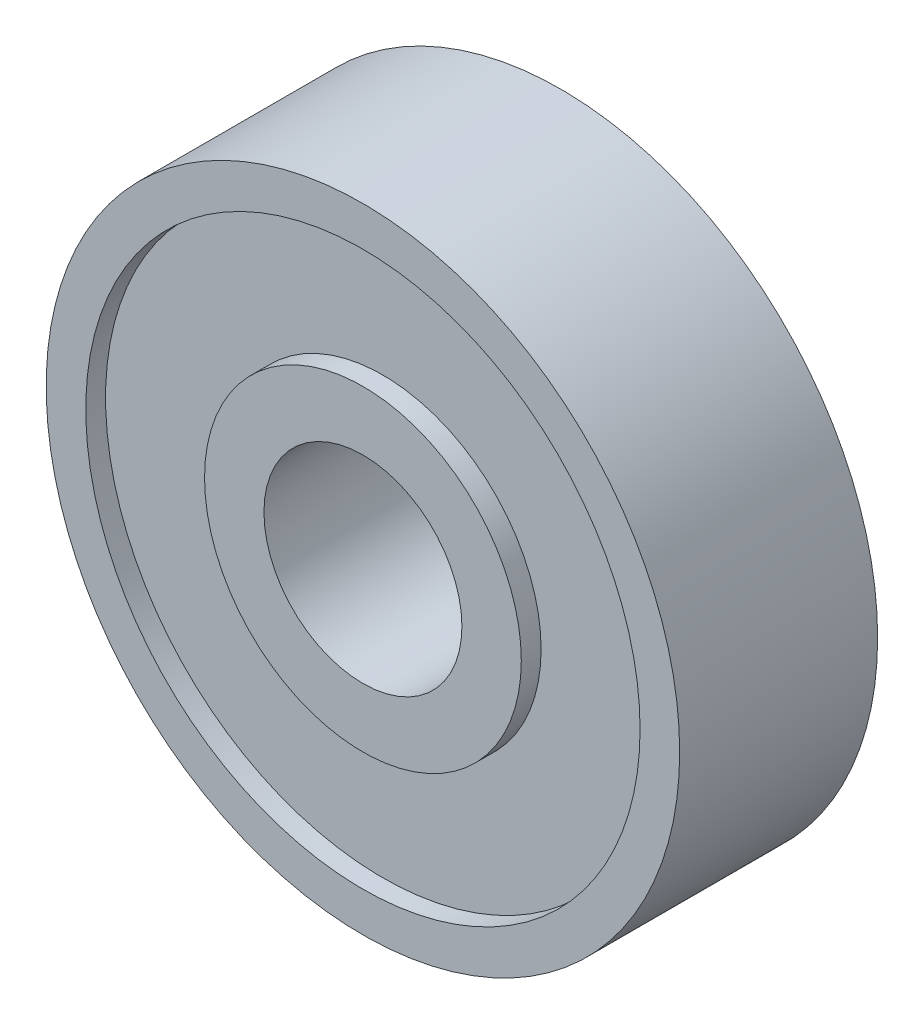
ISO-10303-21;
HEADER;
FILE_DESCRIPTION(('STEP AP214'),'2;1');
FILE_NAME('part.step','',(''),(''),'','','');
FILE_SCHEMA(('AUTOMOTIVE_DESIGN { 1 0 10303 214 1 1 1 1 }'));
ENDSEC;
DATA;
#1=APPLICATION_CONTEXT('core data for automotive mechanical design processes');
#2=APPLICATION_PROTOCOL_DEFINITION('international standard','automotive_design',2000,#1);
#3=PRODUCT_CONTEXT('',#1,'mechanical');
#4=PRODUCT('Part','Part','',(#3));
#5=PRODUCT_RELATED_PRODUCT_CATEGORY('part','',(#4));
#6=PRODUCT_DEFINITION_FORMATION('','',#4);
#7=PRODUCT_DEFINITION_CONTEXT('part definition',#1,'design');
#8=PRODUCT_DEFINITION('design','',#6,#7);
#9=PRODUCT_DEFINITION_SHAPE('','',#8);
#10=(LENGTH_UNIT() NAMED_UNIT(*) SI_UNIT(.MILLI.,.METRE.));
#11=(NAMED_UNIT(*) PLANE_ANGLE_UNIT() SI_UNIT($,.RADIAN.));
#12=(NAMED_UNIT(*) SI_UNIT($,.STERADIAN.) SOLID_ANGLE_UNIT());
#13=UNCERTAINTY_MEASURE_WITH_UNIT(LENGTH_MEASURE(1.E-05),#10,'distance_accuracy_value','');
#14=(GEOMETRIC_REPRESENTATION_CONTEXT(3) GLOBAL_UNCERTAINTY_ASSIGNED_CONTEXT((#13)) GLOBAL_UNIT_ASSIGNED_CONTEXT((#10,
#11,#12)) REPRESENTATION_CONTEXT('',''));
#15=CARTESIAN_POINT('',(0.,0.,0.));
#16=DIRECTION('',(0.,0.,1.));
#17=DIRECTION('',(1.,0.,0.));
#18=AXIS2_PLACEMENT_3D('',#15,#16,#17);
#19=CARTESIAN_POINT('',(0.,0.,0.));
#20=DIRECTION('',(0.,0.,1.));
#21=DIRECTION('',(1.,0.,0.));
#22=AXIS2_PLACEMENT_3D('',#19,#20,#21);
#23=PLANE('',#22);
#24=CARTESIAN_POINT('',(0.,0.,0.));
#25=DIRECTION('',(0.,0.,1.));
#26=DIRECTION('',(1.,0.,0.));
#27=AXIS2_PLACEMENT_3D('',#24,#25,#26);
#28=CIRCLE('',#27,2.5);
#29=CARTESIAN_POINT('',(2.5,0.,0.));
#30=VERTEX_POINT('',#29);
#31=EDGE_CURVE('E67',#30,#30,#28,.T.);
#32=ORIENTED_EDGE('',*,*,#31,.T.);
#33=EDGE_LOOP('',(#32));
#34=FACE_BOUND('',#33,.T.);
#35=CARTESIAN_POINT('',(0.,0.,0.));
#36=DIRECTION('',(0.,0.,-1.));
#37=DIRECTION('',(-1.,0.,0.));
#38=AXIS2_PLACEMENT_3D('',#35,#36,#37);
#39=CIRCLE('',#38,5.);
#40=CARTESIAN_POINT('',(-5.,0.,0.));
#41=VERTEX_POINT('',#40);
#42=EDGE_CURVE('E79',#41,#41,#39,.T.);
#43=ORIENTED_EDGE('',*,*,#42,.T.);
#44=EDGE_LOOP('',(#43));
#45=FACE_BOUND('',#44,.T.);
#46=ADVANCED_FACE('F36',(#34,#45),#23,.F.);
#47=CARTESIAN_POINT('',(0.,0.,5.));
#48=DIRECTION('',(0.,0.,-1.));
#49=DIRECTION('',(-1.,0.,0.));
#50=AXIS2_PLACEMENT_3D('',#47,#48,#49);
#51=CYLINDRICAL_SURFACE('',#50,7.);
#52=CARTESIAN_POINT('',(0.,0.,4.5));
#53=DIRECTION('',(0.,0.,1.));
#54=DIRECTION('',(1.,0.,0.));
#55=AXIS2_PLACEMENT_3D('',#52,#53,#54);
#56=CIRCLE('',#55,7.);
#57=CARTESIAN_POINT('',(7.,0.,4.5));
#58=VERTEX_POINT('',#57);
#59=EDGE_CURVE('E10',#58,#58,#56,.T.);
#60=ORIENTED_EDGE('',*,*,#59,.F.);
#61=EDGE_LOOP('',(#60));
#62=FACE_BOUND('',#61,.T.);
#63=CARTESIAN_POINT('',(0.,0.,5.));
#64=DIRECTION('',(0.,0.,1.));
#65=DIRECTION('',(1.,0.,0.));
#66=AXIS2_PLACEMENT_3D('',#63,#64,#65);
#67=CIRCLE('',#66,7.);
#68=CARTESIAN_POINT('',(7.,0.,5.));
#69=VERTEX_POINT('',#68);
#70=EDGE_CURVE('E47',#69,#69,#67,.T.);
#71=ORIENTED_EDGE('',*,*,#70,.T.);
#72=EDGE_LOOP('',(#71));
#73=FACE_BOUND('',#72,.T.);
#74=ADVANCED_FACE('F38',(#62,#73),#51,.F.);
#75=CARTESIAN_POINT('',(0.,0.,5.));
#76=DIRECTION('',(0.,0.,-1.));
#77=DIRECTION('',(-1.,0.,0.));
#78=AXIS2_PLACEMENT_3D('',#75,#76,#77);
#79=CYLINDRICAL_SURFACE('',#78,8.);
#80=CARTESIAN_POINT('',(0.,0.,5.));
#81=DIRECTION('',(0.,0.,1.));
#82=DIRECTION('',(1.,0.,0.));
#83=AXIS2_PLACEMENT_3D('',#80,#81,#82);
#84=CIRCLE('',#83,8.);
#85=CARTESIAN_POINT('',(8.,0.,5.));
#86=VERTEX_POINT('',#85);
#87=EDGE_CURVE('E43',#86,#86,#84,.T.);
#88=ORIENTED_EDGE('',*,*,#87,.F.);
#89=EDGE_LOOP('',(#88));
#90=FACE_BOUND('',#89,.T.);
#91=CARTESIAN_POINT('',(0.,0.,0.));
#92=DIRECTION('',(0.,0.,1.));
#93=DIRECTION('',(1.,0.,0.));
#94=AXIS2_PLACEMENT_3D('',#91,#92,#93);
#95=CIRCLE('',#94,8.);
#96=CARTESIAN_POINT('',(8.,0.,0.));
#97=VERTEX_POINT('',#96);
#98=EDGE_CURVE('E52',#97,#97,#95,.T.);
#99=ORIENTED_EDGE('',*,*,#98,.T.);
#100=EDGE_LOOP('',(#99));
#101=FACE_BOUND('',#100,.T.);
#102=ADVANCED_FACE('F114',(#90,#101),#79,.T.);
#103=CARTESIAN_POINT('',(0.,0.,5.));
#104=DIRECTION('',(0.,0.,1.));
#105=DIRECTION('',(1.,0.,0.));
#106=AXIS2_PLACEMENT_3D('',#103,#104,#105);
#107=PLANE('',#106);
#108=ORIENTED_EDGE('',*,*,#70,.F.);
#109=EDGE_LOOP('',(#108));
#110=FACE_BOUND('',#109,.T.);
#111=ORIENTED_EDGE('',*,*,#87,.T.);
#112=EDGE_LOOP('',(#111));
#113=FACE_BOUND('',#112,.T.);
#114=ADVANCED_FACE('F105',(#110,#113),#107,.T.);
#115=CARTESIAN_POINT('',(0.,0.,0.));
#116=DIRECTION('',(0.,0.,-1.));
#117=DIRECTION('',(-1.,0.,0.));
#118=AXIS2_PLACEMENT_3D('',#115,#116,#117);
#119=CIRCLE('',#118,7.);
#120=CARTESIAN_POINT('',(-7.,0.,0.));
#121=VERTEX_POINT('',#120);
#122=EDGE_CURVE('E73',#121,#121,#119,.T.);
#123=ORIENTED_EDGE('',*,*,#122,.F.);
#124=EDGE_LOOP('',(#123));
#125=FACE_BOUND('',#124,.T.);
#126=ORIENTED_EDGE('',*,*,#98,.F.);
#127=EDGE_LOOP('',(#126));
#128=FACE_BOUND('',#127,.T.);
#129=ADVANCED_FACE('F101',(#125,#128),#23,.F.);
#130=CARTESIAN_POINT('',(0.,0.,4.5));
#131=DIRECTION('',(0.,0.,1.));
#132=DIRECTION('',(1.,0.,0.));
#133=AXIS2_PLACEMENT_3D('',#130,#131,#132);
#134=PLANE('',#133);
#135=CARTESIAN_POINT('',(0.,0.,4.5));
#136=DIRECTION('',(0.,0.,1.));
#137=DIRECTION('',(1.,0.,0.));
#138=AXIS2_PLACEMENT_3D('',#135,#136,#137);
#139=CIRCLE('',#138,4.);
#140=CARTESIAN_POINT('',(4.,0.,4.5));
#141=VERTEX_POINT('',#140);
#142=EDGE_CURVE('E56',#141,#141,#139,.T.);
#143=ORIENTED_EDGE('',*,*,#142,.F.);
#144=EDGE_LOOP('',(#143));
#145=FACE_BOUND('',#144,.T.);
#146=ORIENTED_EDGE('',*,*,#59,.T.);
#147=EDGE_LOOP('',(#146));
#148=FACE_BOUND('',#147,.T.);
#149=ADVANCED_FACE('F104',(#145,#148),#134,.T.);
#150=CARTESIAN_POINT('',(0.,0.,5.));
#151=DIRECTION('',(0.,0.,-1.));
#152=DIRECTION('',(-1.,0.,0.));
#153=AXIS2_PLACEMENT_3D('',#150,#151,#152);
#154=CYLINDRICAL_SURFACE('',#153,2.5);
#155=CARTESIAN_POINT('',(0.,0.,5.));
#156=DIRECTION('',(0.,0.,1.));
#157=DIRECTION('',(1.,0.,0.));
#158=AXIS2_PLACEMENT_3D('',#155,#156,#157);
#159=CIRCLE('',#158,2.5);
#160=CARTESIAN_POINT('',(2.5,0.,5.));
#161=VERTEX_POINT('',#160);
#162=EDGE_CURVE('E64',#161,#161,#159,.T.);
#163=ORIENTED_EDGE('',*,*,#162,.T.);
#164=EDGE_LOOP('',(#163));
#165=FACE_BOUND('',#164,.T.);
#166=ORIENTED_EDGE('',*,*,#31,.F.);
#167=EDGE_LOOP('',(#166));
#168=FACE_BOUND('',#167,.T.);
#169=ADVANCED_FACE('F111',(#165,#168),#154,.F.);
#170=CARTESIAN_POINT('',(0.,0.,5.));
#171=DIRECTION('',(0.,0.,-1.));
#172=DIRECTION('',(-1.,0.,0.));
#173=AXIS2_PLACEMENT_3D('',#170,#171,#172);
#174=CYLINDRICAL_SURFACE('',#173,4.);
#175=ORIENTED_EDGE('',*,*,#142,.T.);
#176=EDGE_LOOP('',(#175));
#177=FACE_BOUND('',#176,.T.);
#178=CARTESIAN_POINT('',(0.,0.,5.));
#179=DIRECTION('',(0.,0.,1.));
#180=DIRECTION('',(1.,0.,0.));
#181=AXIS2_PLACEMENT_3D('',#178,#179,#180);
#182=CIRCLE('',#181,4.);
#183=CARTESIAN_POINT('',(4.,0.,5.));
#184=VERTEX_POINT('',#183);
#185=EDGE_CURVE('E60',#184,#184,#182,.T.);
#186=ORIENTED_EDGE('',*,*,#185,.F.);
#187=EDGE_LOOP('',(#186));
#188=FACE_BOUND('',#187,.T.);
#189=ADVANCED_FACE('F133',(#177,#188),#174,.T.);
#190=CARTESIAN_POINT('',(0.,0.,5.));
#191=DIRECTION('',(0.,0.,1.));
#192=DIRECTION('',(1.,0.,0.));
#193=AXIS2_PLACEMENT_3D('',#190,#191,#192);
#194=PLANE('',#193);
#195=ORIENTED_EDGE('',*,*,#162,.F.);
#196=EDGE_LOOP('',(#195));
#197=FACE_BOUND('',#196,.T.);
#198=ORIENTED_EDGE('',*,*,#185,.T.);
#199=EDGE_LOOP('',(#198));
#200=FACE_BOUND('',#199,.T.);
#201=ADVANCED_FACE('F97',(#197,#200),#194,.T.);
#202=CARTESIAN_POINT('',(0.,0.,0.5));
#203=DIRECTION('',(0.,0.,-1.));
#204=DIRECTION('',(-1.,0.,0.));
#205=AXIS2_PLACEMENT_3D('',#202,#203,#204);
#206=CYLINDRICAL_SURFACE('',#205,7.);
#207=CARTESIAN_POINT('',(0.,0.,0.5));
#208=DIRECTION('',(0.,0.,-1.));
#209=DIRECTION('',(-1.,0.,0.));
#210=AXIS2_PLACEMENT_3D('',#207,#208,#209);
#211=CIRCLE('',#210,7.);
#212=CARTESIAN_POINT('',(-7.,0.,0.5));
#213=VERTEX_POINT('',#212);
#214=EDGE_CURVE('E69',#213,#213,#211,.T.);
#215=ORIENTED_EDGE('',*,*,#214,.F.);
#216=EDGE_LOOP('',(#215));
#217=FACE_BOUND('',#216,.T.);
#218=ORIENTED_EDGE('',*,*,#122,.T.);
#219=EDGE_LOOP('',(#218));
#220=FACE_BOUND('',#219,.T.);
#221=ADVANCED_FACE('F91',(#217,#220),#206,.F.);
#222=CARTESIAN_POINT('',(0.,0.,0.5));
#223=DIRECTION('',(0.,0.,-1.));
#224=DIRECTION('',(-1.,0.,0.));
#225=AXIS2_PLACEMENT_3D('',#222,#223,#224);
#226=PLANE('',#225);
#227=CARTESIAN_POINT('',(0.,0.,0.5));
#228=DIRECTION('',(0.,0.,-1.));
#229=DIRECTION('',(-1.,0.,0.));
#230=AXIS2_PLACEMENT_3D('',#227,#228,#229);
#231=CIRCLE('',#230,5.);
#232=CARTESIAN_POINT('',(-5.,0.,0.5));
#233=VERTEX_POINT('',#232);
#234=EDGE_CURVE('E76',#233,#233,#231,.T.);
#235=ORIENTED_EDGE('',*,*,#234,.F.);
#236=EDGE_LOOP('',(#235));
#237=FACE_BOUND('',#236,.T.);
#238=ORIENTED_EDGE('',*,*,#214,.T.);
#239=EDGE_LOOP('',(#238));
#240=FACE_BOUND('',#239,.T.);
#241=ADVANCED_FACE('F88',(#237,#240),#226,.T.);
#242=CARTESIAN_POINT('',(0.,0.,0.5));
#243=DIRECTION('',(0.,0.,-1.));
#244=DIRECTION('',(-1.,0.,0.));
#245=AXIS2_PLACEMENT_3D('',#242,#243,#244);
#246=CYLINDRICAL_SURFACE('',#245,5.);
#247=ORIENTED_EDGE('',*,*,#234,.T.);
#248=EDGE_LOOP('',(#247));
#249=FACE_BOUND('',#248,.T.);
#250=ORIENTED_EDGE('',*,*,#42,.F.);
#251=EDGE_LOOP('',(#250));
#252=FACE_BOUND('',#251,.T.);
#253=ADVANCED_FACE('F85',(#249,#252),#246,.T.);
#254=CLOSED_SHELL('',(#46,#74,#102,#114,#129,#149,#169,#189,#201,#221,#241,#253));
#255=MANIFOLD_SOLID_BREP('B2',#254);
#256=ADVANCED_BREP_SHAPE_REPRESENTATION('',(#18,#255),#14);
#257=SHAPE_DEFINITION_REPRESENTATION(#9,#256);
ENDSEC;
END-ISO-10303-21;
